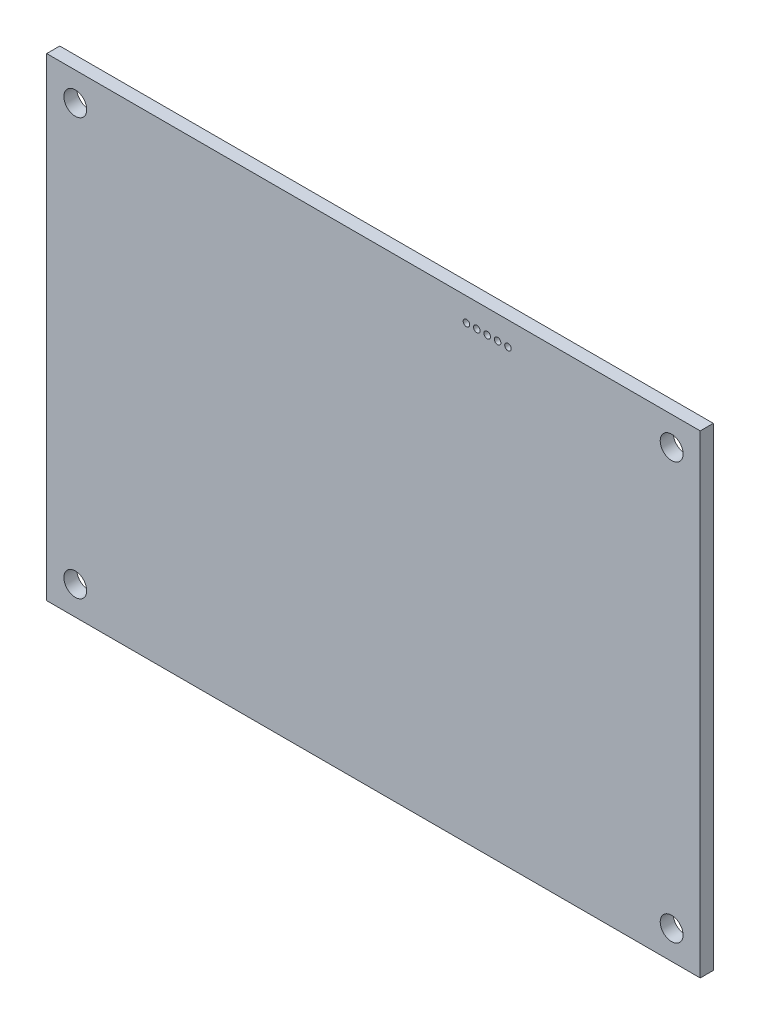
ISO-10303-21;
HEADER;
FILE_DESCRIPTION(('STEP AP214'),'2;1');
FILE_NAME('part.step','',(''),(''),'','','');
FILE_SCHEMA(('AUTOMOTIVE_DESIGN { 1 0 10303 214 1 1 1 1 }'));
ENDSEC;
DATA;
#1=APPLICATION_CONTEXT('core data for automotive mechanical design processes');
#2=APPLICATION_PROTOCOL_DEFINITION('international standard','automotive_design',2000,#1);
#3=PRODUCT_CONTEXT('',#1,'mechanical');
#4=PRODUCT('Part','Part','',(#3));
#5=PRODUCT_RELATED_PRODUCT_CATEGORY('part','',(#4));
#6=PRODUCT_DEFINITION_FORMATION('','',#4);
#7=PRODUCT_DEFINITION_CONTEXT('part definition',#1,'design');
#8=PRODUCT_DEFINITION('design','',#6,#7);
#9=PRODUCT_DEFINITION_SHAPE('','',#8);
#10=(LENGTH_UNIT() NAMED_UNIT(*) SI_UNIT(.MILLI.,.METRE.));
#11=(NAMED_UNIT(*) PLANE_ANGLE_UNIT() SI_UNIT($,.RADIAN.));
#12=(NAMED_UNIT(*) SI_UNIT($,.STERADIAN.) SOLID_ANGLE_UNIT());
#13=UNCERTAINTY_MEASURE_WITH_UNIT(LENGTH_MEASURE(1.E-05),#10,'distance_accuracy_value','');
#14=(GEOMETRIC_REPRESENTATION_CONTEXT(3) GLOBAL_UNCERTAINTY_ASSIGNED_CONTEXT((#13)) GLOBAL_UNIT_ASSIGNED_CONTEXT((#10,
#11,#12)) REPRESENTATION_CONTEXT('',''));
#15=CARTESIAN_POINT('',(0.,0.,0.));
#16=DIRECTION('',(0.,0.,1.));
#17=DIRECTION('',(1.,0.,0.));
#18=AXIS2_PLACEMENT_3D('',#15,#16,#17);
#19=CARTESIAN_POINT('',(0.,0.,1.5999841));
#20=DIRECTION('',(0.,0.,1.));
#21=DIRECTION('',(1.,0.,0.));
#22=AXIS2_PLACEMENT_3D('',#19,#20,#21);
#23=PLANE('',#22);
#24=CARTESIAN_POINT('',(55.19499502,55.12500278,1.5999841));
#25=DIRECTION('',(0.,0.,-1.));
#26=DIRECTION('',(-1.,0.,0.));
#27=AXIS2_PLACEMENT_3D('',#24,#25,#26);
#28=CIRCLE('',#27,0.3999992);
#29=CARTESIAN_POINT('',(54.79499582,55.12500278,1.5999841));
#30=VERTEX_POINT('',#29);
#31=EDGE_CURVE('E107',#30,#30,#28,.T.);
#32=ORIENTED_EDGE('',*,*,#31,.T.);
#33=EDGE_LOOP('',(#32));
#34=FACE_BOUND('',#33,.T.);
#35=CARTESIAN_POINT('',(56.46499502,55.12499516,1.5999841));
#36=DIRECTION('',(0.,0.,-1.));
#37=DIRECTION('',(-1.,0.,0.));
#38=AXIS2_PLACEMENT_3D('',#35,#36,#37);
#39=CIRCLE('',#38,0.3999992);
#40=CARTESIAN_POINT('',(56.06499582,55.12499516,1.5999841));
#41=VERTEX_POINT('',#40);
#42=EDGE_CURVE('E110',#41,#41,#39,.T.);
#43=ORIENTED_EDGE('',*,*,#42,.T.);
#44=EDGE_LOOP('',(#43));
#45=FACE_BOUND('',#44,.T.);
#46=CARTESIAN_POINT('',(53.9250001,55.12500024,1.5999841));
#47=DIRECTION('',(0.,0.,-1.));
#48=DIRECTION('',(-1.,0.,0.));
#49=AXIS2_PLACEMENT_3D('',#46,#47,#48);
#50=CIRCLE('',#49,0.3999992);
#51=CARTESIAN_POINT('',(53.5250009,55.12500024,1.5999841));
#52=VERTEX_POINT('',#51);
#53=EDGE_CURVE('E113',#52,#52,#50,.T.);
#54=ORIENTED_EDGE('',*,*,#53,.T.);
#55=EDGE_LOOP('',(#54));
#56=FACE_BOUND('',#55,.T.);
#57=CARTESIAN_POINT('',(76.4999994,3.50000062,1.5999841));
#58=DIRECTION('',(0.,0.,-1.));
#59=DIRECTION('',(-1.,0.,0.));
#60=AXIS2_PLACEMENT_3D('',#57,#58,#59);
#61=CIRCLE('',#60,1.39999974);
#62=CARTESIAN_POINT('',(75.09999966,3.50000062,1.5999841));
#63=VERTEX_POINT('',#62);
#64=EDGE_CURVE('E116',#63,#63,#61,.T.);
#65=ORIENTED_EDGE('',*,*,#64,.T.);
#66=EDGE_LOOP('',(#65));
#67=FACE_BOUND('',#66,.T.);
#68=CARTESIAN_POINT('',(76.4999994,54.50000022,1.5999841));
#69=DIRECTION('',(0.,0.,-1.));
#70=DIRECTION('',(-1.,0.,0.));
#71=AXIS2_PLACEMENT_3D('',#68,#69,#70);
#72=CIRCLE('',#71,1.39999974);
#73=CARTESIAN_POINT('',(75.09999966,54.50000022,1.5999841));
#74=VERTEX_POINT('',#73);
#75=EDGE_CURVE('E119',#74,#74,#72,.T.);
#76=ORIENTED_EDGE('',*,*,#75,.T.);
#77=EDGE_LOOP('',(#76));
#78=FACE_BOUND('',#77,.T.);
#79=CARTESIAN_POINT('',(52.65500518,55.1249977,1.5999841));
#80=DIRECTION('',(0.,0.,-1.));
#81=DIRECTION('',(-1.,0.,0.));
#82=AXIS2_PLACEMENT_3D('',#79,#80,#81);
#83=CIRCLE('',#82,0.3999992);
#84=CARTESIAN_POINT('',(52.25500598,55.1249977,1.5999841));
#85=VERTEX_POINT('',#84);
#86=EDGE_CURVE('E122',#85,#85,#83,.T.);
#87=ORIENTED_EDGE('',*,*,#86,.T.);
#88=EDGE_LOOP('',(#87));
#89=FACE_BOUND('',#88,.T.);
#90=CARTESIAN_POINT('',(51.38500518,55.12500532,1.5999841));
#91=DIRECTION('',(0.,0.,-1.));
#92=DIRECTION('',(-1.,0.,0.));
#93=AXIS2_PLACEMENT_3D('',#90,#91,#92);
#94=CIRCLE('',#93,0.3999992);
#95=CARTESIAN_POINT('',(50.98500598,55.12500532,1.5999841));
#96=VERTEX_POINT('',#95);
#97=EDGE_CURVE('E125',#96,#96,#94,.T.);
#98=ORIENTED_EDGE('',*,*,#97,.T.);
#99=EDGE_LOOP('',(#98));
#100=FACE_BOUND('',#99,.T.);
#101=CARTESIAN_POINT('',(3.50000062,3.50000062,1.5999841));
#102=DIRECTION('',(0.,0.,-1.));
#103=DIRECTION('',(-1.,0.,0.));
#104=AXIS2_PLACEMENT_3D('',#101,#102,#103);
#105=CIRCLE('',#104,1.39999974);
#106=CARTESIAN_POINT('',(2.10000088,3.50000062,1.5999841));
#107=VERTEX_POINT('',#106);
#108=EDGE_CURVE('E127',#107,#107,#105,.T.);
#109=ORIENTED_EDGE('',*,*,#108,.T.);
#110=EDGE_LOOP('',(#109));
#111=FACE_BOUND('',#110,.T.);
#112=CARTESIAN_POINT('',(3.50000062,54.50000022,1.5999841));
#113=DIRECTION('',(0.,0.,-1.));
#114=DIRECTION('',(-1.,0.,0.));
#115=AXIS2_PLACEMENT_3D('',#112,#113,#114);
#116=CIRCLE('',#115,1.39999974);
#117=CARTESIAN_POINT('',(2.10000088,54.50000022,1.5999841));
#118=VERTEX_POINT('',#117);
#119=EDGE_CURVE('E20',#118,#118,#116,.T.);
#120=ORIENTED_EDGE('',*,*,#119,.T.);
#121=EDGE_LOOP('',(#120));
#122=FACE_BOUND('',#121,.T.);
#123=DIRECTION('',(1.,0.,0.));
#124=VECTOR('',#123,1.);
#125=CARTESIAN_POINT('',(0.,58.,1.5999841));
#126=LINE('',#125,#124);
#127=CARTESIAN_POINT('',(0.,58.,1.5999841));
#128=VERTEX_POINT('',#127);
#129=CARTESIAN_POINT('',(80.,58.,1.5999841));
#130=VERTEX_POINT('',#129);
#131=EDGE_CURVE('E54',#128,#130,#126,.T.);
#132=ORIENTED_EDGE('',*,*,#131,.F.);
#133=DIRECTION('',(0.,1.,0.));
#134=VECTOR('',#133,1.);
#135=CARTESIAN_POINT('',(0.,0.,1.5999841));
#136=LINE('',#135,#134);
#137=CARTESIAN_POINT('',(0.,0.,1.5999841));
#138=VERTEX_POINT('',#137);
#139=EDGE_CURVE('E71',#138,#128,#136,.T.);
#140=ORIENTED_EDGE('',*,*,#139,.F.);
#141=DIRECTION('',(1.,0.,0.));
#142=VECTOR('',#141,1.);
#143=CARTESIAN_POINT('',(80.,0.,1.5999841));
#144=LINE('',#143,#142);
#145=CARTESIAN_POINT('',(80.,0.,1.5999841));
#146=VERTEX_POINT('',#145);
#147=EDGE_CURVE('E68',#146,#138,#144,.F.);
#148=ORIENTED_EDGE('',*,*,#147,.F.);
#149=DIRECTION('',(0.,1.,0.));
#150=VECTOR('',#149,1.);
#151=CARTESIAN_POINT('',(80.,58.,1.5999841));
#152=LINE('',#151,#150);
#153=EDGE_CURVE('E59',#130,#146,#152,.F.);
#154=ORIENTED_EDGE('',*,*,#153,.F.);
#155=EDGE_LOOP('',(#132,#140,#148,#154));
#156=FACE_BOUND('',#155,.T.);
#157=ADVANCED_FACE('F17',(#34,#45,#56,#67,#78,#89,#100,#111,#122,#156),#23,.T.);
#158=CARTESIAN_POINT('',(80.,0.,0.));
#159=DIRECTION('',(0.,-1.,0.));
#160=DIRECTION('',(0.,0.,-1.));
#161=AXIS2_PLACEMENT_3D('',#158,#159,#160);
#162=PLANE('',#161);
#163=DIRECTION('',(0.,0.,1.));
#164=VECTOR('',#163,1.);
#165=CARTESIAN_POINT('',(0.,0.,0.));
#166=LINE('',#165,#164);
#167=CARTESIAN_POINT('',(0.,0.,0.));
#168=VERTEX_POINT('',#167);
#169=EDGE_CURVE('E135',#168,#138,#166,.T.);
#170=ORIENTED_EDGE('',*,*,#169,.F.);
#171=DIRECTION('',(1.,0.,0.));
#172=VECTOR('',#171,1.);
#173=CARTESIAN_POINT('',(0.,0.,0.));
#174=LINE('',#173,#172);
#175=CARTESIAN_POINT('',(80.,0.,0.));
#176=VERTEX_POINT('',#175);
#177=EDGE_CURVE('E78',#168,#176,#174,.T.);
#178=ORIENTED_EDGE('',*,*,#177,.T.);
#179=DIRECTION('',(0.,0.,-1.));
#180=VECTOR('',#179,1.);
#181=CARTESIAN_POINT('',(80.,0.,0.));
#182=LINE('',#181,#180);
#183=EDGE_CURVE('E64',#146,#176,#182,.T.);
#184=ORIENTED_EDGE('',*,*,#183,.F.);
#185=ORIENTED_EDGE('',*,*,#147,.T.);
#186=EDGE_LOOP('',(#170,#178,#184,#185));
#187=FACE_BOUND('',#186,.T.);
#188=ADVANCED_FACE('F77',(#187),#162,.T.);
#189=CARTESIAN_POINT('',(80.,58.,0.));
#190=DIRECTION('',(1.,0.,0.));
#191=DIRECTION('',(0.,0.,-1.));
#192=AXIS2_PLACEMENT_3D('',#189,#190,#191);
#193=PLANE('',#192);
#194=ORIENTED_EDGE('',*,*,#183,.T.);
#195=DIRECTION('',(0.,1.,0.));
#196=VECTOR('',#195,1.);
#197=CARTESIAN_POINT('',(80.,0.,0.));
#198=LINE('',#197,#196);
#199=CARTESIAN_POINT('',(80.,58.,0.));
#200=VERTEX_POINT('',#199);
#201=EDGE_CURVE('E146',#176,#200,#198,.T.);
#202=ORIENTED_EDGE('',*,*,#201,.T.);
#203=DIRECTION('',(0.,0.,1.));
#204=VECTOR('',#203,1.);
#205=CARTESIAN_POINT('',(80.,58.,0.));
#206=LINE('',#205,#204);
#207=EDGE_CURVE('E66',#130,#200,#206,.F.);
#208=ORIENTED_EDGE('',*,*,#207,.F.);
#209=ORIENTED_EDGE('',*,*,#153,.T.);
#210=EDGE_LOOP('',(#194,#202,#208,#209));
#211=FACE_BOUND('',#210,.T.);
#212=ADVANCED_FACE('F61',(#211),#193,.T.);
#213=CARTESIAN_POINT('',(0.,58.,0.));
#214=DIRECTION('',(0.,1.,0.));
#215=DIRECTION('',(0.,0.,1.));
#216=AXIS2_PLACEMENT_3D('',#213,#214,#215);
#217=PLANE('',#216);
#218=ORIENTED_EDGE('',*,*,#207,.T.);
#219=DIRECTION('',(1.,0.,0.));
#220=VECTOR('',#219,1.);
#221=CARTESIAN_POINT('',(0.,58.,0.));
#222=LINE('',#221,#220);
#223=CARTESIAN_POINT('',(0.,58.,0.));
#224=VERTEX_POINT('',#223);
#225=EDGE_CURVE('E143',#200,#224,#222,.F.);
#226=ORIENTED_EDGE('',*,*,#225,.T.);
#227=DIRECTION('',(0.,0.,1.));
#228=VECTOR('',#227,1.);
#229=CARTESIAN_POINT('',(0.,58.,0.));
#230=LINE('',#229,#228);
#231=EDGE_CURVE('E35',#128,#224,#230,.F.);
#232=ORIENTED_EDGE('',*,*,#231,.F.);
#233=ORIENTED_EDGE('',*,*,#131,.T.);
#234=EDGE_LOOP('',(#218,#226,#232,#233));
#235=FACE_BOUND('',#234,.T.);
#236=ADVANCED_FACE('F142',(#235),#217,.T.);
#237=CARTESIAN_POINT('',(0.,0.,0.));
#238=DIRECTION('',(-1.,0.,0.));
#239=DIRECTION('',(0.,0.,1.));
#240=AXIS2_PLACEMENT_3D('',#237,#238,#239);
#241=PLANE('',#240);
#242=ORIENTED_EDGE('',*,*,#231,.T.);
#243=DIRECTION('',(0.,1.,0.));
#244=VECTOR('',#243,1.);
#245=CARTESIAN_POINT('',(0.,0.,0.));
#246=LINE('',#245,#244);
#247=EDGE_CURVE('E106',#224,#168,#246,.F.);
#248=ORIENTED_EDGE('',*,*,#247,.T.);
#249=ORIENTED_EDGE('',*,*,#169,.T.);
#250=ORIENTED_EDGE('',*,*,#139,.T.);
#251=EDGE_LOOP('',(#242,#248,#249,#250));
#252=FACE_BOUND('',#251,.T.);
#253=ADVANCED_FACE('F149',(#252),#241,.T.);
#254=CARTESIAN_POINT('',(3.50000062,54.50000022,0.));
#255=DIRECTION('',(0.,0.,-1.));
#256=DIRECTION('',(-1.,0.,0.));
#257=AXIS2_PLACEMENT_3D('',#254,#255,#256);
#258=CYLINDRICAL_SURFACE('',#257,1.39999974);
#259=ORIENTED_EDGE('',*,*,#119,.F.);
#260=EDGE_LOOP('',(#259));
#261=FACE_BOUND('',#260,.T.);
#262=CARTESIAN_POINT('',(3.50000062,54.50000022,0.));
#263=DIRECTION('',(0.,0.,-1.));
#264=DIRECTION('',(-1.,0.,0.));
#265=AXIS2_PLACEMENT_3D('',#262,#263,#264);
#266=CIRCLE('',#265,1.39999974);
#267=CARTESIAN_POINT('',(2.10000088,54.50000022,0.));
#268=VERTEX_POINT('',#267);
#269=EDGE_CURVE('E103',#268,#268,#266,.T.);
#270=ORIENTED_EDGE('',*,*,#269,.T.);
#271=EDGE_LOOP('',(#270));
#272=FACE_BOUND('',#271,.T.);
#273=ADVANCED_FACE('F151',(#261,#272),#258,.F.);
#274=CARTESIAN_POINT('',(3.50000062,3.50000062,0.));
#275=DIRECTION('',(0.,0.,-1.));
#276=DIRECTION('',(-1.,0.,0.));
#277=AXIS2_PLACEMENT_3D('',#274,#275,#276);
#278=CYLINDRICAL_SURFACE('',#277,1.39999974);
#279=ORIENTED_EDGE('',*,*,#108,.F.);
#280=EDGE_LOOP('',(#279));
#281=FACE_BOUND('',#280,.T.);
#282=CARTESIAN_POINT('',(3.50000062,3.50000062,0.));
#283=DIRECTION('',(0.,0.,-1.));
#284=DIRECTION('',(-1.,0.,0.));
#285=AXIS2_PLACEMENT_3D('',#282,#283,#284);
#286=CIRCLE('',#285,1.39999974);
#287=CARTESIAN_POINT('',(2.10000088,3.50000062,0.));
#288=VERTEX_POINT('',#287);
#289=EDGE_CURVE('E100',#288,#288,#286,.T.);
#290=ORIENTED_EDGE('',*,*,#289,.T.);
#291=EDGE_LOOP('',(#290));
#292=FACE_BOUND('',#291,.T.);
#293=ADVANCED_FACE('F158',(#281,#292),#278,.F.);
#294=CARTESIAN_POINT('',(51.38500518,55.12500532,0.));
#295=DIRECTION('',(0.,0.,-1.));
#296=DIRECTION('',(-1.,0.,0.));
#297=AXIS2_PLACEMENT_3D('',#294,#295,#296);
#298=CYLINDRICAL_SURFACE('',#297,0.3999992);
#299=ORIENTED_EDGE('',*,*,#97,.F.);
#300=EDGE_LOOP('',(#299));
#301=FACE_BOUND('',#300,.T.);
#302=CARTESIAN_POINT('',(51.38500518,55.12500532,0.));
#303=DIRECTION('',(0.,0.,-1.));
#304=DIRECTION('',(-1.,0.,0.));
#305=AXIS2_PLACEMENT_3D('',#302,#303,#304);
#306=CIRCLE('',#305,0.3999992);
#307=CARTESIAN_POINT('',(50.98500598,55.12500532,0.));
#308=VERTEX_POINT('',#307);
#309=EDGE_CURVE('E97',#308,#308,#306,.T.);
#310=ORIENTED_EDGE('',*,*,#309,.T.);
#311=EDGE_LOOP('',(#310));
#312=FACE_BOUND('',#311,.T.);
#313=ADVANCED_FACE('F193',(#301,#312),#298,.F.);
#314=CARTESIAN_POINT('',(52.65500518,55.1249977,0.));
#315=DIRECTION('',(0.,0.,-1.));
#316=DIRECTION('',(-1.,0.,0.));
#317=AXIS2_PLACEMENT_3D('',#314,#315,#316);
#318=CYLINDRICAL_SURFACE('',#317,0.3999992);
#319=ORIENTED_EDGE('',*,*,#86,.F.);
#320=EDGE_LOOP('',(#319));
#321=FACE_BOUND('',#320,.T.);
#322=CARTESIAN_POINT('',(52.65500518,55.1249977,0.));
#323=DIRECTION('',(0.,0.,-1.));
#324=DIRECTION('',(-1.,0.,0.));
#325=AXIS2_PLACEMENT_3D('',#322,#323,#324);
#326=CIRCLE('',#325,0.3999992);
#327=CARTESIAN_POINT('',(52.25500598,55.1249977,0.));
#328=VERTEX_POINT('',#327);
#329=EDGE_CURVE('E94',#328,#328,#326,.T.);
#330=ORIENTED_EDGE('',*,*,#329,.T.);
#331=EDGE_LOOP('',(#330));
#332=FACE_BOUND('',#331,.T.);
#333=ADVANCED_FACE('F189',(#321,#332),#318,.F.);
#334=CARTESIAN_POINT('',(76.4999994,54.50000022,0.));
#335=DIRECTION('',(0.,0.,-1.));
#336=DIRECTION('',(-1.,0.,0.));
#337=AXIS2_PLACEMENT_3D('',#334,#335,#336);
#338=CYLINDRICAL_SURFACE('',#337,1.39999974);
#339=ORIENTED_EDGE('',*,*,#75,.F.);
#340=EDGE_LOOP('',(#339));
#341=FACE_BOUND('',#340,.T.);
#342=CARTESIAN_POINT('',(76.4999994,54.50000022,0.));
#343=DIRECTION('',(0.,0.,-1.));
#344=DIRECTION('',(-1.,0.,0.));
#345=AXIS2_PLACEMENT_3D('',#342,#343,#344);
#346=CIRCLE('',#345,1.39999974);
#347=CARTESIAN_POINT('',(75.09999966,54.50000022,0.));
#348=VERTEX_POINT('',#347);
#349=EDGE_CURVE('E91',#348,#348,#346,.T.);
#350=ORIENTED_EDGE('',*,*,#349,.T.);
#351=EDGE_LOOP('',(#350));
#352=FACE_BOUND('',#351,.T.);
#353=ADVANCED_FACE('F185',(#341,#352),#338,.F.);
#354=CARTESIAN_POINT('',(76.4999994,3.50000062,0.));
#355=DIRECTION('',(0.,0.,-1.));
#356=DIRECTION('',(-1.,0.,0.));
#357=AXIS2_PLACEMENT_3D('',#354,#355,#356);
#358=CYLINDRICAL_SURFACE('',#357,1.39999974);
#359=ORIENTED_EDGE('',*,*,#64,.F.);
#360=EDGE_LOOP('',(#359));
#361=FACE_BOUND('',#360,.T.);
#362=CARTESIAN_POINT('',(76.4999994,3.50000062,0.));
#363=DIRECTION('',(0.,0.,-1.));
#364=DIRECTION('',(-1.,0.,0.));
#365=AXIS2_PLACEMENT_3D('',#362,#363,#364);
#366=CIRCLE('',#365,1.39999974);
#367=CARTESIAN_POINT('',(75.09999966,3.50000062,0.));
#368=VERTEX_POINT('',#367);
#369=EDGE_CURVE('E88',#368,#368,#366,.T.);
#370=ORIENTED_EDGE('',*,*,#369,.T.);
#371=EDGE_LOOP('',(#370));
#372=FACE_BOUND('',#371,.T.);
#373=ADVANCED_FACE('F181',(#361,#372),#358,.F.);
#374=CARTESIAN_POINT('',(53.9250001,55.12500024,0.));
#375=DIRECTION('',(0.,0.,-1.));
#376=DIRECTION('',(-1.,0.,0.));
#377=AXIS2_PLACEMENT_3D('',#374,#375,#376);
#378=CYLINDRICAL_SURFACE('',#377,0.3999992);
#379=ORIENTED_EDGE('',*,*,#53,.F.);
#380=EDGE_LOOP('',(#379));
#381=FACE_BOUND('',#380,.T.);
#382=CARTESIAN_POINT('',(53.9250001,55.12500024,0.));
#383=DIRECTION('',(0.,0.,-1.));
#384=DIRECTION('',(-1.,0.,0.));
#385=AXIS2_PLACEMENT_3D('',#382,#383,#384);
#386=CIRCLE('',#385,0.3999992);
#387=CARTESIAN_POINT('',(53.5250009,55.12500024,0.));
#388=VERTEX_POINT('',#387);
#389=EDGE_CURVE('E85',#388,#388,#386,.T.);
#390=ORIENTED_EDGE('',*,*,#389,.T.);
#391=EDGE_LOOP('',(#390));
#392=FACE_BOUND('',#391,.T.);
#393=ADVANCED_FACE('F177',(#381,#392),#378,.F.);
#394=CARTESIAN_POINT('',(56.46499502,55.12499516,0.));
#395=DIRECTION('',(0.,0.,-1.));
#396=DIRECTION('',(-1.,0.,0.));
#397=AXIS2_PLACEMENT_3D('',#394,#395,#396);
#398=CYLINDRICAL_SURFACE('',#397,0.3999992);
#399=ORIENTED_EDGE('',*,*,#42,.F.);
#400=EDGE_LOOP('',(#399));
#401=FACE_BOUND('',#400,.T.);
#402=CARTESIAN_POINT('',(56.46499502,55.12499516,0.));
#403=DIRECTION('',(0.,0.,-1.));
#404=DIRECTION('',(-1.,0.,0.));
#405=AXIS2_PLACEMENT_3D('',#402,#403,#404);
#406=CIRCLE('',#405,0.3999992);
#407=CARTESIAN_POINT('',(56.06499582,55.12499516,0.));
#408=VERTEX_POINT('',#407);
#409=EDGE_CURVE('E26',#408,#408,#406,.T.);
#410=ORIENTED_EDGE('',*,*,#409,.T.);
#411=EDGE_LOOP('',(#410));
#412=FACE_BOUND('',#411,.T.);
#413=ADVANCED_FACE('F169',(#401,#412),#398,.F.);
#414=CARTESIAN_POINT('',(55.19499502,55.12500278,0.));
#415=DIRECTION('',(0.,0.,-1.));
#416=DIRECTION('',(-1.,0.,0.));
#417=AXIS2_PLACEMENT_3D('',#414,#415,#416);
#418=CYLINDRICAL_SURFACE('',#417,0.3999992);
#419=ORIENTED_EDGE('',*,*,#31,.F.);
#420=EDGE_LOOP('',(#419));
#421=FACE_BOUND('',#420,.T.);
#422=CARTESIAN_POINT('',(55.19499502,55.12500278,0.));
#423=DIRECTION('',(0.,0.,-1.));
#424=DIRECTION('',(-1.,0.,0.));
#425=AXIS2_PLACEMENT_3D('',#422,#423,#424);
#426=CIRCLE('',#425,0.3999992);
#427=CARTESIAN_POINT('',(54.79499582,55.12500278,0.));
#428=VERTEX_POINT('',#427);
#429=EDGE_CURVE('E11',#428,#428,#426,.T.);
#430=ORIENTED_EDGE('',*,*,#429,.T.);
#431=EDGE_LOOP('',(#430));
#432=FACE_BOUND('',#431,.T.);
#433=ADVANCED_FACE('F163',(#421,#432),#418,.F.);
#434=CARTESIAN_POINT('',(0.,0.,0.));
#435=DIRECTION('',(0.,0.,1.));
#436=DIRECTION('',(1.,0.,0.));
#437=AXIS2_PLACEMENT_3D('',#434,#435,#436);
#438=PLANE('',#437);
#439=ORIENTED_EDGE('',*,*,#429,.F.);
#440=EDGE_LOOP('',(#439));
#441=FACE_BOUND('',#440,.T.);
#442=ORIENTED_EDGE('',*,*,#409,.F.);
#443=EDGE_LOOP('',(#442));
#444=FACE_BOUND('',#443,.T.);
#445=ORIENTED_EDGE('',*,*,#389,.F.);
#446=EDGE_LOOP('',(#445));
#447=FACE_BOUND('',#446,.T.);
#448=ORIENTED_EDGE('',*,*,#369,.F.);
#449=EDGE_LOOP('',(#448));
#450=FACE_BOUND('',#449,.T.);
#451=ORIENTED_EDGE('',*,*,#349,.F.);
#452=EDGE_LOOP('',(#451));
#453=FACE_BOUND('',#452,.T.);
#454=ORIENTED_EDGE('',*,*,#329,.F.);
#455=EDGE_LOOP('',(#454));
#456=FACE_BOUND('',#455,.T.);
#457=ORIENTED_EDGE('',*,*,#309,.F.);
#458=EDGE_LOOP('',(#457));
#459=FACE_BOUND('',#458,.T.);
#460=ORIENTED_EDGE('',*,*,#289,.F.);
#461=EDGE_LOOP('',(#460));
#462=FACE_BOUND('',#461,.T.);
#463=ORIENTED_EDGE('',*,*,#269,.F.);
#464=EDGE_LOOP('',(#463));
#465=FACE_BOUND('',#464,.T.);
#466=ORIENTED_EDGE('',*,*,#225,.F.);
#467=ORIENTED_EDGE('',*,*,#201,.F.);
#468=ORIENTED_EDGE('',*,*,#177,.F.);
#469=ORIENTED_EDGE('',*,*,#247,.F.);
#470=EDGE_LOOP('',(#466,#467,#468,#469));
#471=FACE_BOUND('',#470,.T.);
#472=ADVANCED_FACE('F145',(#441,#444,#447,#450,#453,#456,#459,#462,#465,#471),#438,.F.);
#473=CLOSED_SHELL('',(#157,#188,#212,#236,#253,#273,#293,#313,#333,#353,#373,#393,#413,#433,#472));
#474=MANIFOLD_SOLID_BREP('B1',#473);
#475=ADVANCED_BREP_SHAPE_REPRESENTATION('',(#18,#474),#14);
#476=SHAPE_DEFINITION_REPRESENTATION(#9,#475);
ENDSEC;
END-ISO-10303-21;
